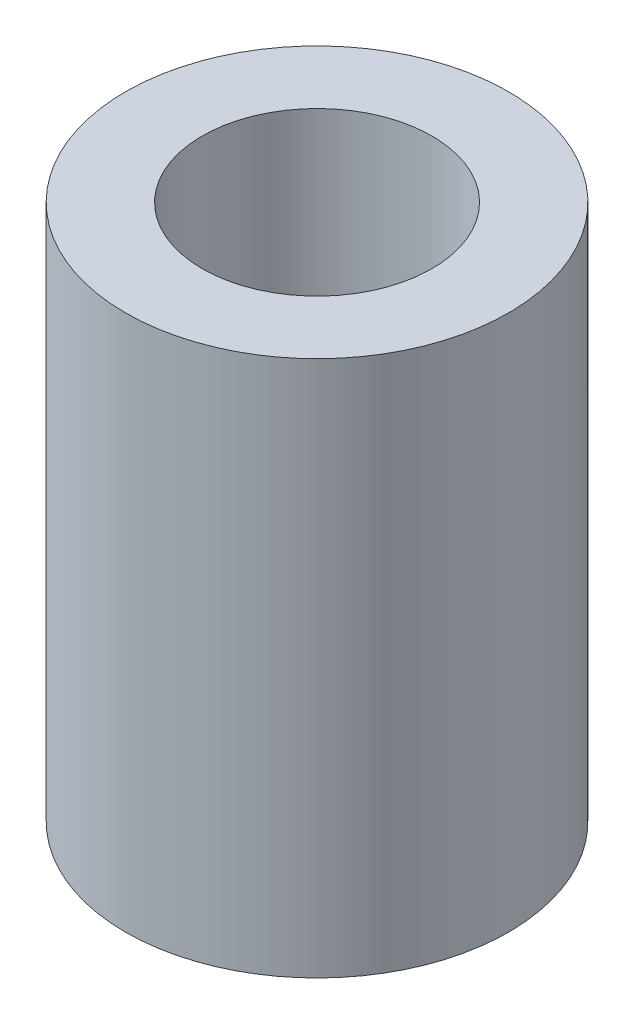
ISO-10303-21;
HEADER;
FILE_DESCRIPTION(('STEP AP214'),'2;1');
FILE_NAME('part.step','',(''),(''),'','','');
FILE_SCHEMA(('AUTOMOTIVE_DESIGN { 1 0 10303 214 1 1 1 1 }'));
ENDSEC;
DATA;
#1=APPLICATION_CONTEXT('core data for automotive mechanical design processes');
#2=APPLICATION_PROTOCOL_DEFINITION('international standard','automotive_design',2000,#1);
#3=PRODUCT_CONTEXT('',#1,'mechanical');
#4=PRODUCT('Part','Part','',(#3));
#5=PRODUCT_RELATED_PRODUCT_CATEGORY('part','',(#4));
#6=PRODUCT_DEFINITION_FORMATION('','',#4);
#7=PRODUCT_DEFINITION_CONTEXT('part definition',#1,'design');
#8=PRODUCT_DEFINITION('design','',#6,#7);
#9=PRODUCT_DEFINITION_SHAPE('','',#8);
#10=(LENGTH_UNIT() NAMED_UNIT(*) SI_UNIT(.MILLI.,.METRE.));
#11=(NAMED_UNIT(*) PLANE_ANGLE_UNIT() SI_UNIT($,.RADIAN.));
#12=(NAMED_UNIT(*) SI_UNIT($,.STERADIAN.) SOLID_ANGLE_UNIT());
#13=UNCERTAINTY_MEASURE_WITH_UNIT(LENGTH_MEASURE(1.E-05),#10,'distance_accuracy_value','');
#14=(GEOMETRIC_REPRESENTATION_CONTEXT(3) GLOBAL_UNCERTAINTY_ASSIGNED_CONTEXT((#13)) GLOBAL_UNIT_ASSIGNED_CONTEXT((#10,
#11,#12)) REPRESENTATION_CONTEXT('',''));
#15=CARTESIAN_POINT('',(0.,0.,0.));
#16=DIRECTION('',(0.,0.,1.));
#17=DIRECTION('',(1.,0.,0.));
#18=AXIS2_PLACEMENT_3D('',#15,#16,#17);
#19=CARTESIAN_POINT('',(0.,7.,0.));
#20=DIRECTION('',(0.,1.,0.));
#21=DIRECTION('',(0.,0.,1.));
#22=AXIS2_PLACEMENT_3D('',#19,#20,#21);
#23=PLANE('',#22);
#24=CARTESIAN_POINT('',(0.,7.,0.));
#25=DIRECTION('',(0.,1.,0.));
#26=DIRECTION('',(0.,0.,1.));
#27=AXIS2_PLACEMENT_3D('',#24,#25,#26);
#28=CIRCLE('',#27,2.5);
#29=CARTESIAN_POINT('',(0.,7.,2.5));
#30=VERTEX_POINT('',#29);
#31=EDGE_CURVE('E10',#30,#30,#28,.T.);
#32=ORIENTED_EDGE('',*,*,#31,.T.);
#33=EDGE_LOOP('',(#32));
#34=FACE_BOUND('',#33,.T.);
#35=CARTESIAN_POINT('',(0.,7.,0.));
#36=DIRECTION('',(0.,1.,0.));
#37=DIRECTION('',(0.,0.,1.));
#38=AXIS2_PLACEMENT_3D('',#35,#36,#37);
#39=CIRCLE('',#38,1.5);
#40=CARTESIAN_POINT('',(0.,7.,1.5));
#41=VERTEX_POINT('',#40);
#42=EDGE_CURVE('E45',#41,#41,#39,.T.);
#43=ORIENTED_EDGE('',*,*,#42,.F.);
#44=EDGE_LOOP('',(#43));
#45=FACE_BOUND('',#44,.T.);
#46=ADVANCED_FACE('F34',(#34,#45),#23,.T.);
#47=CARTESIAN_POINT('',(0.,0.,0.));
#48=DIRECTION('',(0.,1.,0.));
#49=DIRECTION('',(0.,0.,1.));
#50=AXIS2_PLACEMENT_3D('',#47,#48,#49);
#51=PLANE('',#50);
#52=CARTESIAN_POINT('',(0.,0.,0.));
#53=DIRECTION('',(0.,1.,0.));
#54=DIRECTION('',(0.,0.,1.));
#55=AXIS2_PLACEMENT_3D('',#52,#53,#54);
#56=CIRCLE('',#55,2.5);
#57=CARTESIAN_POINT('',(0.,0.,2.5));
#58=VERTEX_POINT('',#57);
#59=EDGE_CURVE('E38',#58,#58,#56,.T.);
#60=ORIENTED_EDGE('',*,*,#59,.F.);
#61=EDGE_LOOP('',(#60));
#62=FACE_BOUND('',#61,.T.);
#63=CARTESIAN_POINT('',(0.,0.,0.));
#64=DIRECTION('',(0.,1.,0.));
#65=DIRECTION('',(0.,0.,1.));
#66=AXIS2_PLACEMENT_3D('',#63,#64,#65);
#67=CIRCLE('',#66,1.5);
#68=CARTESIAN_POINT('',(0.,0.,1.5));
#69=VERTEX_POINT('',#68);
#70=EDGE_CURVE('E47',#69,#69,#67,.T.);
#71=ORIENTED_EDGE('',*,*,#70,.T.);
#72=EDGE_LOOP('',(#71));
#73=FACE_BOUND('',#72,.T.);
#74=ADVANCED_FACE('F57',(#62,#73),#51,.F.);
#75=CARTESIAN_POINT('',(0.,7.,0.));
#76=DIRECTION('',(0.,-1.,0.));
#77=DIRECTION('',(0.,0.,-1.));
#78=AXIS2_PLACEMENT_3D('',#75,#76,#77);
#79=CYLINDRICAL_SURFACE('',#78,2.5);
#80=ORIENTED_EDGE('',*,*,#31,.F.);
#81=EDGE_LOOP('',(#80));
#82=FACE_BOUND('',#81,.T.);
#83=ORIENTED_EDGE('',*,*,#59,.T.);
#84=EDGE_LOOP('',(#83));
#85=FACE_BOUND('',#84,.T.);
#86=ADVANCED_FACE('F36',(#82,#85),#79,.T.);
#87=CARTESIAN_POINT('',(0.,7.,0.));
#88=DIRECTION('',(0.,-1.,0.));
#89=DIRECTION('',(0.,0.,-1.));
#90=AXIS2_PLACEMENT_3D('',#87,#88,#89);
#91=CYLINDRICAL_SURFACE('',#90,1.5);
#92=ORIENTED_EDGE('',*,*,#42,.T.);
#93=EDGE_LOOP('',(#92));
#94=FACE_BOUND('',#93,.T.);
#95=ORIENTED_EDGE('',*,*,#70,.F.);
#96=EDGE_LOOP('',(#95));
#97=FACE_BOUND('',#96,.T.);
#98=ADVANCED_FACE('F53',(#94,#97),#91,.F.);
#99=CLOSED_SHELL('',(#46,#74,#86,#98));
#100=MANIFOLD_SOLID_BREP('B2',#99);
#101=ADVANCED_BREP_SHAPE_REPRESENTATION('',(#18,#100),#14);
#102=SHAPE_DEFINITION_REPRESENTATION(#9,#101);
ENDSEC;
END-ISO-10303-21;
